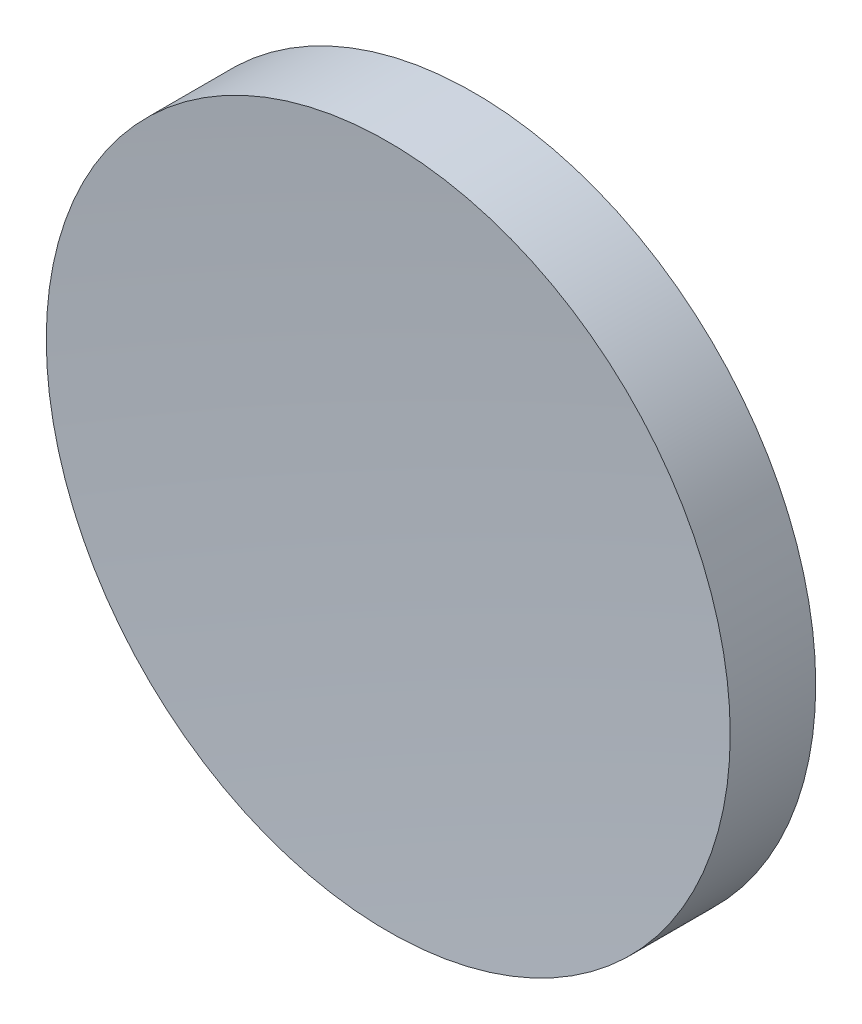
ISO-10303-21;
HEADER;
FILE_DESCRIPTION(('STEP AP214'),'2;1');
FILE_NAME('part.step','',(''),(''),'','','');
FILE_SCHEMA(('AUTOMOTIVE_DESIGN { 1 0 10303 214 1 1 1 1 }'));
ENDSEC;
DATA;
#1=APPLICATION_CONTEXT('core data for automotive mechanical design processes');
#2=APPLICATION_PROTOCOL_DEFINITION('international standard','automotive_design',2000,#1);
#3=PRODUCT_CONTEXT('',#1,'mechanical');
#4=PRODUCT('Part','Part','',(#3));
#5=PRODUCT_RELATED_PRODUCT_CATEGORY('part','',(#4));
#6=PRODUCT_DEFINITION_FORMATION('','',#4);
#7=PRODUCT_DEFINITION_CONTEXT('part definition',#1,'design');
#8=PRODUCT_DEFINITION('design','',#6,#7);
#9=PRODUCT_DEFINITION_SHAPE('','',#8);
#10=(LENGTH_UNIT() NAMED_UNIT(*) SI_UNIT(.MILLI.,.METRE.));
#11=(NAMED_UNIT(*) PLANE_ANGLE_UNIT() SI_UNIT($,.RADIAN.));
#12=(NAMED_UNIT(*) SI_UNIT($,.STERADIAN.) SOLID_ANGLE_UNIT());
#13=UNCERTAINTY_MEASURE_WITH_UNIT(LENGTH_MEASURE(1.E-05),#10,'distance_accuracy_value','');
#14=(GEOMETRIC_REPRESENTATION_CONTEXT(3) GLOBAL_UNCERTAINTY_ASSIGNED_CONTEXT((#13)) GLOBAL_UNIT_ASSIGNED_CONTEXT((#10,
#11,#12)) REPRESENTATION_CONTEXT('',''));
#15=CARTESIAN_POINT('',(0.,0.,0.));
#16=DIRECTION('',(0.,0.,1.));
#17=DIRECTION('',(1.,0.,0.));
#18=AXIS2_PLACEMENT_3D('',#15,#16,#17);
#19=CARTESIAN_POINT('',(0.,0.,25.));
#20=DIRECTION('',(0.,0.,-1.));
#21=DIRECTION('',(-1.,0.,0.));
#22=AXIS2_PLACEMENT_3D('',#19,#20,#21);
#23=CYLINDRICAL_SURFACE('',#22,100.);
#24=CARTESIAN_POINT('',(1.94289029309402E-13,0.,24.9999999999999));
#25=DIRECTION('',(0.,0.,1.));
#26=DIRECTION('',(1.,0.,0.));
#27=AXIS2_PLACEMENT_3D('',#24,#25,#26);
#28=CIRCLE('',#27,100.000000000003);
#29=CARTESIAN_POINT('',(100.000000000004,0.,24.9999999999999));
#30=VERTEX_POINT('',#29);
#31=EDGE_CURVE('E44',#30,#30,#28,.F.);
#32=ORIENTED_EDGE('',*,*,#31,.T.);
#33=EDGE_LOOP('',(#32));
#34=FACE_BOUND('',#33,.T.);
#35=CARTESIAN_POINT('',(0.,0.,0.));
#36=DIRECTION('',(0.,0.,1.));
#37=DIRECTION('',(1.,0.,0.));
#38=AXIS2_PLACEMENT_3D('',#35,#36,#37);
#39=CIRCLE('',#38,100.);
#40=CARTESIAN_POINT('',(100.,0.,0.));
#41=VERTEX_POINT('',#40);
#42=EDGE_CURVE('E10',#41,#41,#39,.T.);
#43=ORIENTED_EDGE('',*,*,#42,.T.);
#44=EDGE_LOOP('',(#43));
#45=FACE_BOUND('',#44,.T.);
#46=ADVANCED_FACE('F37',(#34,#45),#23,.T.);
#47=CARTESIAN_POINT('',(0.,0.,0.));
#48=DIRECTION('',(0.,0.,1.));
#49=DIRECTION('',(1.,0.,0.));
#50=AXIS2_PLACEMENT_3D('',#47,#48,#49);
#51=PLANE('',#50);
#52=ORIENTED_EDGE('',*,*,#42,.F.);
#53=EDGE_LOOP('',(#52));
#54=FACE_BOUND('',#53,.T.);
#55=ADVANCED_FACE('F54',(#54),#51,.F.);
#56=CARTESIAN_POINT('',(1.94289029309402E-13,0.,1621.87194226713));
#57=DIRECTION('',(0.,0.,-1.));
#58=DIRECTION('',(1.,0.,0.));
#59=AXIS2_PLACEMENT_3D('',#56,#57,#58);
#60=SPHERICAL_SURFACE('',#59,1600.);
#61=ORIENTED_EDGE('',*,*,#31,.F.);
#62=EDGE_LOOP('',(#61));
#63=FACE_BOUND('',#62,.T.);
#64=ADVANCED_FACE('F52',(#63),#60,.F.);
#65=CLOSED_SHELL('',(#46,#55,#64));
#66=MANIFOLD_SOLID_BREP('B2',#65);
#67=ADVANCED_BREP_SHAPE_REPRESENTATION('',(#18,#66),#14);
#68=SHAPE_DEFINITION_REPRESENTATION(#9,#67);
ENDSEC;
END-ISO-10303-21;
